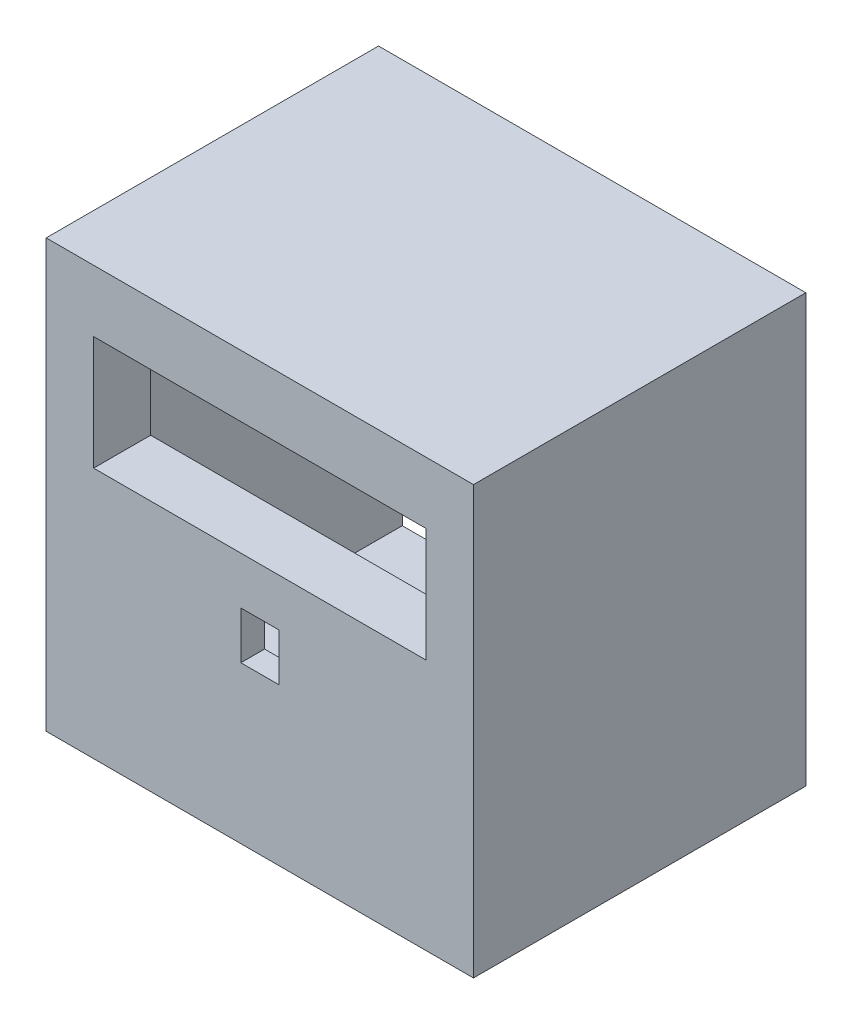
ISO-10303-21;
HEADER;
FILE_DESCRIPTION(('STEP AP214'),'2;1');
FILE_NAME('part.step','',(''),(''),'','','');
FILE_SCHEMA(('AUTOMOTIVE_DESIGN { 1 0 10303 214 1 1 1 1 }'));
ENDSEC;
DATA;
#1=APPLICATION_CONTEXT('core data for automotive mechanical design processes');
#2=APPLICATION_PROTOCOL_DEFINITION('international standard','automotive_design',2000,#1);
#3=PRODUCT_CONTEXT('',#1,'mechanical');
#4=PRODUCT('Part','Part','',(#3));
#5=PRODUCT_RELATED_PRODUCT_CATEGORY('part','',(#4));
#6=PRODUCT_DEFINITION_FORMATION('','',#4);
#7=PRODUCT_DEFINITION_CONTEXT('part definition',#1,'design');
#8=PRODUCT_DEFINITION('design','',#6,#7);
#9=PRODUCT_DEFINITION_SHAPE('','',#8);
#10=(LENGTH_UNIT() NAMED_UNIT(*) SI_UNIT(.MILLI.,.METRE.));
#11=(NAMED_UNIT(*) PLANE_ANGLE_UNIT() SI_UNIT($,.RADIAN.));
#12=(NAMED_UNIT(*) SI_UNIT($,.STERADIAN.) SOLID_ANGLE_UNIT());
#13=UNCERTAINTY_MEASURE_WITH_UNIT(LENGTH_MEASURE(1.E-05),#10,'distance_accuracy_value','');
#14=(GEOMETRIC_REPRESENTATION_CONTEXT(3) GLOBAL_UNCERTAINTY_ASSIGNED_CONTEXT((#13)) GLOBAL_UNIT_ASSIGNED_CONTEXT((#10,
#11,#12)) REPRESENTATION_CONTEXT('',''));
#15=CARTESIAN_POINT('',(0.,0.,0.));
#16=DIRECTION('',(0.,0.,1.));
#17=DIRECTION('',(1.,0.,0.));
#18=AXIS2_PLACEMENT_3D('',#15,#16,#17);
#19=CARTESIAN_POINT('',(40.,-45.,70.));
#20=DIRECTION('',(-1.,0.,0.));
#21=DIRECTION('',(0.,0.,1.));
#22=AXIS2_PLACEMENT_3D('',#19,#20,#21);
#23=PLANE('',#22);
#24=DIRECTION('',(0.,0.,1.));
#25=VECTOR('',#24,1.);
#26=CARTESIAN_POINT('',(40.,38.,58.));
#27=LINE('',#26,#25);
#28=CARTESIAN_POINT('',(40.,38.,58.));
#29=VERTEX_POINT('',#28);
#30=CARTESIAN_POINT('',(40.,38.,65.));
#31=VERTEX_POINT('',#30);
#32=EDGE_CURVE('E250',#29,#31,#27,.T.);
#33=ORIENTED_EDGE('',*,*,#32,.T.);
#34=DIRECTION('',(0.,1.,0.));
#35=VECTOR('',#34,1.);
#36=CARTESIAN_POINT('',(40.,0.,65.));
#37=LINE('',#36,#35);
#38=CARTESIAN_POINT('',(40.,40.,65.));
#39=VERTEX_POINT('',#38);
#40=EDGE_CURVE('E297',#31,#39,#37,.T.);
#41=ORIENTED_EDGE('',*,*,#40,.T.);
#42=DIRECTION('',(0.,0.,-1.));
#43=VECTOR('',#42,1.);
#44=CARTESIAN_POINT('',(40.,40.,70.));
#45=LINE('',#44,#43);
#46=CARTESIAN_POINT('',(40.,40.,0.));
#47=VERTEX_POINT('',#46);
#48=EDGE_CURVE('E287',#39,#47,#45,.T.);
#49=ORIENTED_EDGE('',*,*,#48,.T.);
#50=DIRECTION('',(0.,1.,0.));
#51=VECTOR('',#50,1.);
#52=CARTESIAN_POINT('',(40.,0.,0.));
#53=LINE('',#52,#51);
#54=CARTESIAN_POINT('',(40.,-40.,0.));
#55=VERTEX_POINT('',#54);
#56=EDGE_CURVE('E286',#55,#47,#53,.T.);
#57=ORIENTED_EDGE('',*,*,#56,.F.);
#58=DIRECTION('',(0.,0.,-1.));
#59=VECTOR('',#58,1.);
#60=CARTESIAN_POINT('',(40.,-40.,70.));
#61=LINE('',#60,#59);
#62=CARTESIAN_POINT('',(40.,-40.,65.));
#63=VERTEX_POINT('',#62);
#64=EDGE_CURVE('E298',#63,#55,#61,.T.);
#65=ORIENTED_EDGE('',*,*,#64,.F.);
#66=CARTESIAN_POINT('',(40.,1.99999999999999,65.));
#67=VERTEX_POINT('',#66);
#68=EDGE_CURVE('E292',#63,#67,#37,.T.);
#69=ORIENTED_EDGE('',*,*,#68,.T.);
#70=DIRECTION('',(0.,0.,1.));
#71=VECTOR('',#70,1.);
#72=CARTESIAN_POINT('',(40.,1.99999999999999,58.));
#73=LINE('',#72,#71);
#74=CARTESIAN_POINT('',(40.,1.99999999999999,58.));
#75=VERTEX_POINT('',#74);
#76=EDGE_CURVE('E258',#75,#67,#73,.T.);
#77=ORIENTED_EDGE('',*,*,#76,.F.);
#78=DIRECTION('',(0.,-1.,0.));
#79=VECTOR('',#78,1.);
#80=CARTESIAN_POINT('',(40.,0.,58.));
#81=LINE('',#80,#79);
#82=CARTESIAN_POINT('',(40.,7.99999999999999,58.));
#83=VERTEX_POINT('',#82);
#84=EDGE_CURVE('E224',#83,#75,#81,.T.);
#85=ORIENTED_EDGE('',*,*,#84,.F.);
#86=DIRECTION('',(0.,0.,1.));
#87=VECTOR('',#86,1.);
#88=CARTESIAN_POINT('',(40.,7.99999999999999,58.));
#89=LINE('',#88,#87);
#90=CARTESIAN_POINT('',(40.,7.99999999999999,65.));
#91=VERTEX_POINT('',#90);
#92=EDGE_CURVE('E260',#83,#91,#89,.T.);
#93=ORIENTED_EDGE('',*,*,#92,.T.);
#94=CARTESIAN_POINT('',(40.,32.,65.));
#95=VERTEX_POINT('',#94);
#96=EDGE_CURVE('E296',#91,#95,#37,.T.);
#97=ORIENTED_EDGE('',*,*,#96,.T.);
#98=DIRECTION('',(0.,0.,1.));
#99=VECTOR('',#98,1.);
#100=CARTESIAN_POINT('',(40.,32.,58.));
#101=LINE('',#100,#99);
#102=CARTESIAN_POINT('',(40.,32.,58.));
#103=VERTEX_POINT('',#102);
#104=EDGE_CURVE('E241',#103,#95,#101,.T.);
#105=ORIENTED_EDGE('',*,*,#104,.F.);
#106=EDGE_CURVE('E228',#29,#103,#81,.T.);
#107=ORIENTED_EDGE('',*,*,#106,.F.);
#108=EDGE_LOOP('',(#33,#41,#49,#57,#65,#69,#77,#85,#93,#97,#105,#107));
#109=FACE_BOUND('',#108,.T.);
#110=ADVANCED_FACE('F37',(#109),#23,.T.);
#111=CARTESIAN_POINT('',(-40.,-45.,70.));
#112=DIRECTION('',(1.,0.,0.));
#113=DIRECTION('',(0.,0.,-1.));
#114=AXIS2_PLACEMENT_3D('',#111,#112,#113);
#115=PLANE('',#114);
#116=DIRECTION('',(0.,1.,0.));
#117=VECTOR('',#116,1.);
#118=CARTESIAN_POINT('',(-40.,0.,58.));
#119=LINE('',#118,#117);
#120=CARTESIAN_POINT('',(-40.,1.99999999999999,58.));
#121=VERTEX_POINT('',#120);
#122=CARTESIAN_POINT('',(-40.,38.,58.));
#123=VERTEX_POINT('',#122);
#124=EDGE_CURVE('E230',#121,#123,#119,.T.);
#125=ORIENTED_EDGE('',*,*,#124,.F.);
#126=DIRECTION('',(0.,0.,1.));
#127=VECTOR('',#126,1.);
#128=CARTESIAN_POINT('',(-40.,1.99999999999999,58.));
#129=LINE('',#128,#127);
#130=CARTESIAN_POINT('',(-40.,1.99999999999999,65.));
#131=VERTEX_POINT('',#130);
#132=EDGE_CURVE('E255',#121,#131,#129,.T.);
#133=ORIENTED_EDGE('',*,*,#132,.T.);
#134=DIRECTION('',(0.,-1.,0.));
#135=VECTOR('',#134,1.);
#136=CARTESIAN_POINT('',(-40.,0.,65.));
#137=LINE('',#136,#135);
#138=CARTESIAN_POINT('',(-40.,-40.,65.));
#139=VERTEX_POINT('',#138);
#140=EDGE_CURVE('E305',#131,#139,#137,.T.);
#141=ORIENTED_EDGE('',*,*,#140,.T.);
#142=DIRECTION('',(0.,0.,-1.));
#143=VECTOR('',#142,1.);
#144=CARTESIAN_POINT('',(-40.,-40.,70.));
#145=LINE('',#144,#143);
#146=CARTESIAN_POINT('',(-40.,-40.,0.));
#147=VERTEX_POINT('',#146);
#148=EDGE_CURVE('E300',#139,#147,#145,.T.);
#149=ORIENTED_EDGE('',*,*,#148,.T.);
#150=DIRECTION('',(0.,-1.,0.));
#151=VECTOR('',#150,1.);
#152=CARTESIAN_POINT('',(-40.,0.,0.));
#153=LINE('',#152,#151);
#154=CARTESIAN_POINT('',(-40.,40.,0.));
#155=VERTEX_POINT('',#154);
#156=EDGE_CURVE('E317',#155,#147,#153,.T.);
#157=ORIENTED_EDGE('',*,*,#156,.F.);
#158=DIRECTION('',(0.,0.,-1.));
#159=VECTOR('',#158,1.);
#160=CARTESIAN_POINT('',(-40.,40.,70.));
#161=LINE('',#160,#159);
#162=CARTESIAN_POINT('',(-40.,40.,65.));
#163=VERTEX_POINT('',#162);
#164=EDGE_CURVE('E291',#163,#155,#161,.T.);
#165=ORIENTED_EDGE('',*,*,#164,.F.);
#166=CARTESIAN_POINT('',(-40.,38.,65.));
#167=VERTEX_POINT('',#166);
#168=EDGE_CURVE('E307',#163,#167,#137,.T.);
#169=ORIENTED_EDGE('',*,*,#168,.T.);
#170=DIRECTION('',(0.,0.,1.));
#171=VECTOR('',#170,1.);
#172=CARTESIAN_POINT('',(-40.,38.,58.));
#173=LINE('',#172,#171);
#174=EDGE_CURVE('E253',#123,#167,#173,.T.);
#175=ORIENTED_EDGE('',*,*,#174,.F.);
#176=EDGE_LOOP('',(#125,#133,#141,#149,#157,#165,#169,#175));
#177=FACE_BOUND('',#176,.T.);
#178=ADVANCED_FACE('F373',(#177),#115,.T.);
#179=CARTESIAN_POINT('',(0.,0.,65.));
#180=DIRECTION('',(0.,0.,-1.));
#181=DIRECTION('',(-1.,0.,0.));
#182=AXIS2_PLACEMENT_3D('',#179,#180,#181);
#183=PLANE('',#182);
#184=ORIENTED_EDGE('',*,*,#96,.F.);
#185=DIRECTION('',(1.,0.,0.));
#186=VECTOR('',#185,1.);
#187=CARTESIAN_POINT('',(0.,7.99999999999999,65.));
#188=LINE('',#187,#186);
#189=CARTESIAN_POINT('',(35.,7.99999999999999,65.));
#190=VERTEX_POINT('',#189);
#191=EDGE_CURVE('E221',#190,#91,#188,.T.);
#192=ORIENTED_EDGE('',*,*,#191,.F.);
#193=DIRECTION('',(0.,1.,0.));
#194=VECTOR('',#193,1.);
#195=CARTESIAN_POINT('',(35.,0.,65.));
#196=LINE('',#195,#194);
#197=CARTESIAN_POINT('',(35.,32.,65.));
#198=VERTEX_POINT('',#197);
#199=EDGE_CURVE('E277',#190,#198,#196,.T.);
#200=ORIENTED_EDGE('',*,*,#199,.T.);
#201=DIRECTION('',(-1.,0.,0.));
#202=VECTOR('',#201,1.);
#203=CARTESIAN_POINT('',(0.,32.,65.));
#204=LINE('',#203,#202);
#205=EDGE_CURVE('E225',#95,#198,#204,.T.);
#206=ORIENTED_EDGE('',*,*,#205,.F.);
#207=EDGE_LOOP('',(#184,#192,#200,#206));
#208=FACE_BOUND('',#207,.T.);
#209=ADVANCED_FACE('F379',(#208),#183,.T.);
#210=DIRECTION('',(0.,-1.,0.));
#211=VECTOR('',#210,1.);
#212=CARTESIAN_POINT('',(3.99999999999999,0.,65.));
#213=LINE('',#212,#211);
#214=CARTESIAN_POINT('',(3.99999999999999,-2.00000000000001,65.));
#215=VERTEX_POINT('',#214);
#216=CARTESIAN_POINT('',(3.99999999999999,-12.,65.));
#217=VERTEX_POINT('',#216);
#218=EDGE_CURVE('E219',#215,#217,#213,.T.);
#219=ORIENTED_EDGE('',*,*,#218,.F.);
#220=DIRECTION('',(1.,0.,0.));
#221=VECTOR('',#220,1.);
#222=CARTESIAN_POINT('',(0.,-2.00000000000001,65.));
#223=LINE('',#222,#221);
#224=CARTESIAN_POINT('',(-4.00000000000001,-2.00000000000001,65.));
#225=VERTEX_POINT('',#224);
#226=EDGE_CURVE('E212',#225,#215,#223,.T.);
#227=ORIENTED_EDGE('',*,*,#226,.F.);
#228=DIRECTION('',(0.,1.,0.));
#229=VECTOR('',#228,1.);
#230=CARTESIAN_POINT('',(-4.00000000000001,0.,65.));
#231=LINE('',#230,#229);
#232=CARTESIAN_POINT('',(-4.00000000000001,-12.,65.));
#233=VERTEX_POINT('',#232);
#234=EDGE_CURVE('E192',#233,#225,#231,.T.);
#235=ORIENTED_EDGE('',*,*,#234,.F.);
#236=DIRECTION('',(-1.,0.,0.));
#237=VECTOR('',#236,1.);
#238=CARTESIAN_POINT('',(0.,-12.,65.));
#239=LINE('',#238,#237);
#240=EDGE_CURVE('E217',#217,#233,#239,.T.);
#241=ORIENTED_EDGE('',*,*,#240,.F.);
#242=EDGE_LOOP('',(#219,#227,#235,#241));
#243=FACE_BOUND('',#242,.T.);
#244=ORIENTED_EDGE('',*,*,#140,.F.);
#245=DIRECTION('',(-1.,0.,0.));
#246=VECTOR('',#245,1.);
#247=CARTESIAN_POINT('',(0.,1.99999999999999,65.));
#248=LINE('',#247,#246);
#249=EDGE_CURVE('E243',#67,#131,#248,.T.);
#250=ORIENTED_EDGE('',*,*,#249,.F.);
#251=ORIENTED_EDGE('',*,*,#68,.F.);
#252=DIRECTION('',(1.,0.,0.));
#253=VECTOR('',#252,1.);
#254=CARTESIAN_POINT('',(0.,-40.,65.));
#255=LINE('',#254,#253);
#256=EDGE_CURVE('E301',#139,#63,#255,.T.);
#257=ORIENTED_EDGE('',*,*,#256,.F.);
#258=EDGE_LOOP('',(#244,#250,#251,#257));
#259=FACE_BOUND('',#258,.T.);
#260=ADVANCED_FACE('F398',(#243,#259),#183,.T.);
#261=CARTESIAN_POINT('',(0.,0.,0.));
#262=DIRECTION('',(0.,0.,-1.));
#263=DIRECTION('',(-1.,0.,0.));
#264=AXIS2_PLACEMENT_3D('',#261,#262,#263);
#265=PLANE('',#264);
#266=DIRECTION('',(0.,1.,0.));
#267=VECTOR('',#266,1.);
#268=CARTESIAN_POINT('',(45.,-45.,0.));
#269=LINE('',#268,#267);
#270=CARTESIAN_POINT('',(45.,-45.,0.));
#271=VERTEX_POINT('',#270);
#272=CARTESIAN_POINT('',(45.,45.,0.));
#273=VERTEX_POINT('',#272);
#274=EDGE_CURVE('E290',#271,#273,#269,.T.);
#275=ORIENTED_EDGE('',*,*,#274,.F.);
#276=DIRECTION('',(1.,0.,0.));
#277=VECTOR('',#276,1.);
#278=CARTESIAN_POINT('',(-45.,-45.,0.));
#279=LINE('',#278,#277);
#280=CARTESIAN_POINT('',(-45.,-45.,0.));
#281=VERTEX_POINT('',#280);
#282=EDGE_CURVE('E326',#281,#271,#279,.T.);
#283=ORIENTED_EDGE('',*,*,#282,.F.);
#284=DIRECTION('',(0.,-1.,0.));
#285=VECTOR('',#284,1.);
#286=CARTESIAN_POINT('',(-45.,-45.,0.));
#287=LINE('',#286,#285);
#288=CARTESIAN_POINT('',(-45.,45.,0.));
#289=VERTEX_POINT('',#288);
#290=EDGE_CURVE('E337',#289,#281,#287,.T.);
#291=ORIENTED_EDGE('',*,*,#290,.F.);
#292=DIRECTION('',(-1.,0.,0.));
#293=VECTOR('',#292,1.);
#294=CARTESIAN_POINT('',(-45.,45.,0.));
#295=LINE('',#294,#293);
#296=EDGE_CURVE('E335',#273,#289,#295,.T.);
#297=ORIENTED_EDGE('',*,*,#296,.F.);
#298=EDGE_LOOP('',(#275,#283,#291,#297));
#299=FACE_BOUND('',#298,.T.);
#300=DIRECTION('',(1.,0.,0.));
#301=VECTOR('',#300,1.);
#302=CARTESIAN_POINT('',(0.,-40.,0.));
#303=LINE('',#302,#301);
#304=EDGE_CURVE('E314',#147,#55,#303,.T.);
#305=ORIENTED_EDGE('',*,*,#304,.T.);
#306=ORIENTED_EDGE('',*,*,#56,.T.);
#307=DIRECTION('',(-1.,0.,0.));
#308=VECTOR('',#307,1.);
#309=CARTESIAN_POINT('',(0.,40.,0.));
#310=LINE('',#309,#308);
#311=EDGE_CURVE('E313',#47,#155,#310,.T.);
#312=ORIENTED_EDGE('',*,*,#311,.T.);
#313=ORIENTED_EDGE('',*,*,#156,.T.);
#314=EDGE_LOOP('',(#305,#306,#312,#313));
#315=FACE_BOUND('',#314,.T.);
#316=ADVANCED_FACE('F355',(#299,#315),#265,.T.);
#317=CARTESIAN_POINT('',(45.,-45.,70.));
#318=DIRECTION('',(-1.,0.,0.));
#319=DIRECTION('',(0.,0.,1.));
#320=AXIS2_PLACEMENT_3D('',#317,#318,#319);
#321=PLANE('',#320);
#322=ORIENTED_EDGE('',*,*,#274,.T.);
#323=DIRECTION('',(0.,0.,-1.));
#324=VECTOR('',#323,1.);
#325=CARTESIAN_POINT('',(45.,45.,70.));
#326=LINE('',#325,#324);
#327=CARTESIAN_POINT('',(45.,45.,70.));
#328=VERTEX_POINT('',#327);
#329=EDGE_CURVE('E11',#328,#273,#326,.T.);
#330=ORIENTED_EDGE('',*,*,#329,.F.);
#331=DIRECTION('',(0.,1.,0.));
#332=VECTOR('',#331,1.);
#333=CARTESIAN_POINT('',(45.,-45.,70.));
#334=LINE('',#333,#332);
#335=CARTESIAN_POINT('',(45.,-45.,70.));
#336=VERTEX_POINT('',#335);
#337=EDGE_CURVE('E322',#336,#328,#334,.T.);
#338=ORIENTED_EDGE('',*,*,#337,.F.);
#339=DIRECTION('',(0.,0.,-1.));
#340=VECTOR('',#339,1.);
#341=CARTESIAN_POINT('',(45.,-45.,70.));
#342=LINE('',#341,#340);
#343=EDGE_CURVE('E332',#336,#271,#342,.T.);
#344=ORIENTED_EDGE('',*,*,#343,.T.);
#345=EDGE_LOOP('',(#322,#330,#338,#344));
#346=FACE_BOUND('',#345,.T.);
#347=ADVANCED_FACE('F39',(#346),#321,.F.);
#348=CARTESIAN_POINT('',(-45.,45.,70.));
#349=DIRECTION('',(0.,-1.,0.));
#350=DIRECTION('',(0.,0.,-1.));
#351=AXIS2_PLACEMENT_3D('',#348,#349,#350);
#352=PLANE('',#351);
#353=ORIENTED_EDGE('',*,*,#296,.T.);
#354=DIRECTION('',(0.,0.,-1.));
#355=VECTOR('',#354,1.);
#356=CARTESIAN_POINT('',(-45.,45.,70.));
#357=LINE('',#356,#355);
#358=CARTESIAN_POINT('',(-45.,45.,70.));
#359=VERTEX_POINT('',#358);
#360=EDGE_CURVE('E45',#359,#289,#357,.T.);
#361=ORIENTED_EDGE('',*,*,#360,.F.);
#362=DIRECTION('',(-1.,0.,0.));
#363=VECTOR('',#362,1.);
#364=CARTESIAN_POINT('',(-45.,45.,70.));
#365=LINE('',#364,#363);
#366=EDGE_CURVE('E325',#328,#359,#365,.T.);
#367=ORIENTED_EDGE('',*,*,#366,.F.);
#368=ORIENTED_EDGE('',*,*,#329,.T.);
#369=EDGE_LOOP('',(#353,#361,#367,#368));
#370=FACE_BOUND('',#369,.T.);
#371=ADVANCED_FACE('F365',(#370),#352,.F.);
#372=CARTESIAN_POINT('',(-45.,-45.,70.));
#373=DIRECTION('',(1.,0.,0.));
#374=DIRECTION('',(0.,0.,-1.));
#375=AXIS2_PLACEMENT_3D('',#372,#373,#374);
#376=PLANE('',#375);
#377=ORIENTED_EDGE('',*,*,#290,.T.);
#378=DIRECTION('',(0.,0.,-1.));
#379=VECTOR('',#378,1.);
#380=CARTESIAN_POINT('',(-45.,-45.,70.));
#381=LINE('',#380,#379);
#382=CARTESIAN_POINT('',(-45.,-45.,70.));
#383=VERTEX_POINT('',#382);
#384=EDGE_CURVE('E342',#383,#281,#381,.T.);
#385=ORIENTED_EDGE('',*,*,#384,.F.);
#386=DIRECTION('',(0.,-1.,0.));
#387=VECTOR('',#386,1.);
#388=CARTESIAN_POINT('',(-45.,-45.,70.));
#389=LINE('',#388,#387);
#390=EDGE_CURVE('E328',#359,#383,#389,.T.);
#391=ORIENTED_EDGE('',*,*,#390,.F.);
#392=ORIENTED_EDGE('',*,*,#360,.T.);
#393=EDGE_LOOP('',(#377,#385,#391,#392));
#394=FACE_BOUND('',#393,.T.);
#395=ADVANCED_FACE('F349',(#394),#376,.F.);
#396=CARTESIAN_POINT('',(-45.,-45.,70.));
#397=DIRECTION('',(0.,1.,0.));
#398=DIRECTION('',(0.,0.,1.));
#399=AXIS2_PLACEMENT_3D('',#396,#397,#398);
#400=PLANE('',#399);
#401=ORIENTED_EDGE('',*,*,#282,.T.);
#402=ORIENTED_EDGE('',*,*,#343,.F.);
#403=DIRECTION('',(1.,0.,0.));
#404=VECTOR('',#403,1.);
#405=CARTESIAN_POINT('',(-45.,-45.,70.));
#406=LINE('',#405,#404);
#407=EDGE_CURVE('E330',#383,#336,#406,.T.);
#408=ORIENTED_EDGE('',*,*,#407,.F.);
#409=ORIENTED_EDGE('',*,*,#384,.T.);
#410=EDGE_LOOP('',(#401,#402,#408,#409));
#411=FACE_BOUND('',#410,.T.);
#412=ADVANCED_FACE('F359',(#411),#400,.F.);
#413=CARTESIAN_POINT('',(0.,0.,70.));
#414=DIRECTION('',(0.,0.,-1.));
#415=DIRECTION('',(-1.,0.,0.));
#416=AXIS2_PLACEMENT_3D('',#413,#414,#415);
#417=PLANE('',#416);
#418=DIRECTION('',(-1.,0.,0.));
#419=VECTOR('',#418,1.);
#420=CARTESIAN_POINT('',(-4.00000000000001,-2.00000000000001,70.));
#421=LINE('',#420,#419);
#422=CARTESIAN_POINT('',(3.99999999999999,-2.00000000000001,70.));
#423=VERTEX_POINT('',#422);
#424=CARTESIAN_POINT('',(-4.00000000000001,-2.00000000000001,70.));
#425=VERTEX_POINT('',#424);
#426=EDGE_CURVE('E198',#423,#425,#421,.T.);
#427=ORIENTED_EDGE('',*,*,#426,.F.);
#428=DIRECTION('',(0.,1.,0.));
#429=VECTOR('',#428,1.);
#430=CARTESIAN_POINT('',(3.99999999999999,-12.,70.));
#431=LINE('',#430,#429);
#432=CARTESIAN_POINT('',(3.99999999999999,-12.,70.));
#433=VERTEX_POINT('',#432);
#434=EDGE_CURVE('E60',#433,#423,#431,.T.);
#435=ORIENTED_EDGE('',*,*,#434,.F.);
#436=DIRECTION('',(1.,0.,0.));
#437=VECTOR('',#436,1.);
#438=CARTESIAN_POINT('',(-4.00000000000001,-12.,70.));
#439=LINE('',#438,#437);
#440=CARTESIAN_POINT('',(-4.00000000000001,-12.,70.));
#441=VERTEX_POINT('',#440);
#442=EDGE_CURVE('E205',#441,#433,#439,.T.);
#443=ORIENTED_EDGE('',*,*,#442,.F.);
#444=DIRECTION('',(0.,-1.,0.));
#445=VECTOR('',#444,1.);
#446=CARTESIAN_POINT('',(-4.00000000000001,-12.,70.));
#447=LINE('',#446,#445);
#448=EDGE_CURVE('E189',#425,#441,#447,.T.);
#449=ORIENTED_EDGE('',*,*,#448,.F.);
#450=EDGE_LOOP('',(#427,#435,#443,#449));
#451=FACE_BOUND('',#450,.T.);
#452=DIRECTION('',(0.,1.,0.));
#453=VECTOR('',#452,1.);
#454=CARTESIAN_POINT('',(35.,0.,70.));
#455=LINE('',#454,#453);
#456=CARTESIAN_POINT('',(35.,7.99999999999999,70.));
#457=VERTEX_POINT('',#456);
#458=CARTESIAN_POINT('',(35.,32.,70.));
#459=VERTEX_POINT('',#458);
#460=EDGE_CURVE('E265',#457,#459,#455,.T.);
#461=ORIENTED_EDGE('',*,*,#460,.F.);
#462=DIRECTION('',(1.,0.,0.));
#463=VECTOR('',#462,1.);
#464=CARTESIAN_POINT('',(0.,7.99999999999999,70.));
#465=LINE('',#464,#463);
#466=CARTESIAN_POINT('',(-35.,7.99999999999999,70.));
#467=VERTEX_POINT('',#466);
#468=EDGE_CURVE('E263',#467,#457,#465,.T.);
#469=ORIENTED_EDGE('',*,*,#468,.F.);
#470=DIRECTION('',(0.,1.,0.));
#471=VECTOR('',#470,1.);
#472=CARTESIAN_POINT('',(-35.,0.,70.));
#473=LINE('',#472,#471);
#474=CARTESIAN_POINT('',(-35.,32.,70.));
#475=VERTEX_POINT('',#474);
#476=EDGE_CURVE('E271',#467,#475,#473,.T.);
#477=ORIENTED_EDGE('',*,*,#476,.T.);
#478=DIRECTION('',(1.,0.,0.));
#479=VECTOR('',#478,1.);
#480=CARTESIAN_POINT('',(0.,32.,70.));
#481=LINE('',#480,#479);
#482=EDGE_CURVE('E268',#475,#459,#481,.T.);
#483=ORIENTED_EDGE('',*,*,#482,.T.);
#484=EDGE_LOOP('',(#461,#469,#477,#483));
#485=FACE_BOUND('',#484,.T.);
#486=ORIENTED_EDGE('',*,*,#337,.T.);
#487=ORIENTED_EDGE('',*,*,#366,.T.);
#488=ORIENTED_EDGE('',*,*,#390,.T.);
#489=ORIENTED_EDGE('',*,*,#407,.T.);
#490=EDGE_LOOP('',(#486,#487,#488,#489));
#491=FACE_BOUND('',#490,.T.);
#492=ADVANCED_FACE('F202',(#451,#485,#491),#417,.F.);
#493=CARTESIAN_POINT('',(-45.,40.,70.));
#494=DIRECTION('',(0.,-1.,0.));
#495=DIRECTION('',(0.,0.,-1.));
#496=AXIS2_PLACEMENT_3D('',#493,#494,#495);
#497=PLANE('',#496);
#498=ORIENTED_EDGE('',*,*,#311,.F.);
#499=ORIENTED_EDGE('',*,*,#48,.F.);
#500=DIRECTION('',(-1.,0.,0.));
#501=VECTOR('',#500,1.);
#502=CARTESIAN_POINT('',(0.,40.,65.));
#503=LINE('',#502,#501);
#504=EDGE_CURVE('E295',#39,#163,#503,.T.);
#505=ORIENTED_EDGE('',*,*,#504,.T.);
#506=ORIENTED_EDGE('',*,*,#164,.T.);
#507=EDGE_LOOP('',(#498,#499,#505,#506));
#508=FACE_BOUND('',#507,.T.);
#509=ADVANCED_FACE('F386',(#508),#497,.T.);
#510=CARTESIAN_POINT('',(-45.,-40.,70.));
#511=DIRECTION('',(0.,1.,0.));
#512=DIRECTION('',(0.,0.,1.));
#513=AXIS2_PLACEMENT_3D('',#510,#511,#512);
#514=PLANE('',#513);
#515=ORIENTED_EDGE('',*,*,#304,.F.);
#516=ORIENTED_EDGE('',*,*,#148,.F.);
#517=ORIENTED_EDGE('',*,*,#256,.T.);
#518=ORIENTED_EDGE('',*,*,#64,.T.);
#519=EDGE_LOOP('',(#515,#516,#517,#518));
#520=FACE_BOUND('',#519,.T.);
#521=ADVANCED_FACE('F388',(#520),#514,.T.);
#522=DIRECTION('',(-1.,0.,0.));
#523=VECTOR('',#522,1.);
#524=CARTESIAN_POINT('',(0.,38.,65.));
#525=LINE('',#524,#523);
#526=EDGE_CURVE('E245',#31,#167,#525,.T.);
#527=ORIENTED_EDGE('',*,*,#526,.T.);
#528=ORIENTED_EDGE('',*,*,#168,.F.);
#529=ORIENTED_EDGE('',*,*,#504,.F.);
#530=ORIENTED_EDGE('',*,*,#40,.F.);
#531=EDGE_LOOP('',(#527,#528,#529,#530));
#532=FACE_BOUND('',#531,.T.);
#533=ADVANCED_FACE('F393',(#532),#183,.T.);
#534=CARTESIAN_POINT('',(0.,7.99999999999999,-0.001000000000001));
#535=DIRECTION('',(0.,-1.,0.));
#536=DIRECTION('',(0.,0.,-1.));
#537=AXIS2_PLACEMENT_3D('',#534,#535,#536);
#538=PLANE('',#537);
#539=DIRECTION('',(0.,0.,1.));
#540=VECTOR('',#539,1.);
#541=CARTESIAN_POINT('',(-35.,7.99999999999999,-0.001000000000001));
#542=LINE('',#541,#540);
#543=CARTESIAN_POINT('',(-35.,7.99999999999999,58.));
#544=VERTEX_POINT('',#543);
#545=EDGE_CURVE('E275',#544,#467,#542,.T.);
#546=ORIENTED_EDGE('',*,*,#545,.T.);
#547=ORIENTED_EDGE('',*,*,#468,.T.);
#548=DIRECTION('',(0.,0.,1.));
#549=VECTOR('',#548,1.);
#550=CARTESIAN_POINT('',(35.,7.99999999999999,-0.001000000000001));
#551=LINE('',#550,#549);
#552=EDGE_CURVE('E274',#190,#457,#551,.T.);
#553=ORIENTED_EDGE('',*,*,#552,.F.);
#554=ORIENTED_EDGE('',*,*,#191,.T.);
#555=ORIENTED_EDGE('',*,*,#92,.F.);
#556=DIRECTION('',(1.,0.,0.));
#557=VECTOR('',#556,1.);
#558=CARTESIAN_POINT('',(0.,7.99999999999999,58.));
#559=LINE('',#558,#557);
#560=EDGE_CURVE('E222',#544,#83,#559,.T.);
#561=ORIENTED_EDGE('',*,*,#560,.F.);
#562=EDGE_LOOP('',(#546,#547,#553,#554,#555,#561));
#563=FACE_BOUND('',#562,.T.);
#564=ADVANCED_FACE('F384',(#563),#538,.F.);
#565=CARTESIAN_POINT('',(-35.,0.,-0.001000000000001));
#566=DIRECTION('',(1.,0.,0.));
#567=DIRECTION('',(0.,0.,-1.));
#568=AXIS2_PLACEMENT_3D('',#565,#566,#567);
#569=PLANE('',#568);
#570=ORIENTED_EDGE('',*,*,#545,.F.);
#571=DIRECTION('',(0.,-1.,0.));
#572=VECTOR('',#571,1.);
#573=CARTESIAN_POINT('',(-35.,0.,58.));
#574=LINE('',#573,#572);
#575=CARTESIAN_POINT('',(-35.,32.,58.));
#576=VERTEX_POINT('',#575);
#577=EDGE_CURVE('E238',#576,#544,#574,.T.);
#578=ORIENTED_EDGE('',*,*,#577,.F.);
#579=DIRECTION('',(0.,0.,1.));
#580=VECTOR('',#579,1.);
#581=CARTESIAN_POINT('',(-35.,32.,-0.001000000000001));
#582=LINE('',#581,#580);
#583=EDGE_CURVE('E278',#576,#475,#582,.T.);
#584=ORIENTED_EDGE('',*,*,#583,.T.);
#585=ORIENTED_EDGE('',*,*,#476,.F.);
#586=EDGE_LOOP('',(#570,#578,#584,#585));
#587=FACE_BOUND('',#586,.T.);
#588=ADVANCED_FACE('F434',(#587),#569,.T.);
#589=CARTESIAN_POINT('',(0.,32.,-0.001000000000001));
#590=DIRECTION('',(0.,-1.,0.));
#591=DIRECTION('',(0.,0.,-1.));
#592=AXIS2_PLACEMENT_3D('',#589,#590,#591);
#593=PLANE('',#592);
#594=ORIENTED_EDGE('',*,*,#583,.F.);
#595=DIRECTION('',(-1.,0.,0.));
#596=VECTOR('',#595,1.);
#597=CARTESIAN_POINT('',(0.,32.,58.));
#598=LINE('',#597,#596);
#599=EDGE_CURVE('E235',#103,#576,#598,.T.);
#600=ORIENTED_EDGE('',*,*,#599,.F.);
#601=ORIENTED_EDGE('',*,*,#104,.T.);
#602=ORIENTED_EDGE('',*,*,#205,.T.);
#603=DIRECTION('',(0.,0.,1.));
#604=VECTOR('',#603,1.);
#605=CARTESIAN_POINT('',(35.,32.,-0.001000000000001));
#606=LINE('',#605,#604);
#607=EDGE_CURVE('E280',#198,#459,#606,.T.);
#608=ORIENTED_EDGE('',*,*,#607,.T.);
#609=ORIENTED_EDGE('',*,*,#482,.F.);
#610=EDGE_LOOP('',(#594,#600,#601,#602,#608,#609));
#611=FACE_BOUND('',#610,.T.);
#612=ADVANCED_FACE('F441',(#611),#593,.T.);
#613=CARTESIAN_POINT('',(35.,0.,-0.001000000000001));
#614=DIRECTION('',(1.,0.,0.));
#615=DIRECTION('',(0.,0.,-1.));
#616=AXIS2_PLACEMENT_3D('',#613,#614,#615);
#617=PLANE('',#616);
#618=ORIENTED_EDGE('',*,*,#552,.T.);
#619=ORIENTED_EDGE('',*,*,#460,.T.);
#620=ORIENTED_EDGE('',*,*,#607,.F.);
#621=ORIENTED_EDGE('',*,*,#199,.F.);
#622=EDGE_LOOP('',(#618,#619,#620,#621));
#623=FACE_BOUND('',#622,.T.);
#624=ADVANCED_FACE('F449',(#623),#617,.F.);
#625=CARTESIAN_POINT('',(0.,1.99999999999999,58.));
#626=DIRECTION('',(0.,1.,0.));
#627=DIRECTION('',(0.,0.,1.));
#628=AXIS2_PLACEMENT_3D('',#625,#626,#627);
#629=PLANE('',#628);
#630=ORIENTED_EDGE('',*,*,#249,.T.);
#631=ORIENTED_EDGE('',*,*,#132,.F.);
#632=DIRECTION('',(-1.,0.,0.));
#633=VECTOR('',#632,1.);
#634=CARTESIAN_POINT('',(0.,1.99999999999999,58.));
#635=LINE('',#634,#633);
#636=EDGE_CURVE('E227',#75,#121,#635,.T.);
#637=ORIENTED_EDGE('',*,*,#636,.F.);
#638=ORIENTED_EDGE('',*,*,#76,.T.);
#639=EDGE_LOOP('',(#630,#631,#637,#638));
#640=FACE_BOUND('',#639,.T.);
#641=ADVANCED_FACE('F457',(#640),#629,.F.);
#642=CARTESIAN_POINT('',(0.,38.,58.));
#643=DIRECTION('',(0.,1.,0.));
#644=DIRECTION('',(0.,0.,1.));
#645=AXIS2_PLACEMENT_3D('',#642,#643,#644);
#646=PLANE('',#645);
#647=ORIENTED_EDGE('',*,*,#526,.F.);
#648=ORIENTED_EDGE('',*,*,#32,.F.);
#649=DIRECTION('',(-1.,0.,0.));
#650=VECTOR('',#649,1.);
#651=CARTESIAN_POINT('',(0.,38.,58.));
#652=LINE('',#651,#650);
#653=EDGE_CURVE('E232',#29,#123,#652,.T.);
#654=ORIENTED_EDGE('',*,*,#653,.T.);
#655=ORIENTED_EDGE('',*,*,#174,.T.);
#656=EDGE_LOOP('',(#647,#648,#654,#655));
#657=FACE_BOUND('',#656,.T.);
#658=ADVANCED_FACE('F464',(#657),#646,.T.);
#659=CARTESIAN_POINT('',(0.,0.,58.));
#660=DIRECTION('',(0.,0.,-1.));
#661=DIRECTION('',(-1.,0.,0.));
#662=AXIS2_PLACEMENT_3D('',#659,#660,#661);
#663=PLANE('',#662);
#664=ORIENTED_EDGE('',*,*,#560,.T.);
#665=ORIENTED_EDGE('',*,*,#84,.T.);
#666=ORIENTED_EDGE('',*,*,#636,.T.);
#667=ORIENTED_EDGE('',*,*,#124,.T.);
#668=ORIENTED_EDGE('',*,*,#653,.F.);
#669=ORIENTED_EDGE('',*,*,#106,.T.);
#670=ORIENTED_EDGE('',*,*,#599,.T.);
#671=ORIENTED_EDGE('',*,*,#577,.T.);
#672=EDGE_LOOP('',(#664,#665,#666,#667,#668,#669,#670,#671));
#673=FACE_BOUND('',#672,.T.);
#674=ADVANCED_FACE('F472',(#673),#663,.T.);
#675=CARTESIAN_POINT('',(3.99999999999999,-12.,60.));
#676=DIRECTION('',(1.,0.,0.));
#677=DIRECTION('',(0.,0.,-1.));
#678=AXIS2_PLACEMENT_3D('',#675,#676,#677);
#679=PLANE('',#678);
#680=ORIENTED_EDGE('',*,*,#218,.T.);
#681=DIRECTION('',(0.,0.,1.));
#682=VECTOR('',#681,1.);
#683=CARTESIAN_POINT('',(3.99999999999999,-12.,60.));
#684=LINE('',#683,#682);
#685=EDGE_CURVE('E210',#217,#433,#684,.T.);
#686=ORIENTED_EDGE('',*,*,#685,.T.);
#687=ORIENTED_EDGE('',*,*,#434,.T.);
#688=DIRECTION('',(0.,0.,1.));
#689=VECTOR('',#688,1.);
#690=CARTESIAN_POINT('',(3.99999999999999,-2.00000000000001,60.));
#691=LINE('',#690,#689);
#692=EDGE_CURVE('E195',#215,#423,#691,.T.);
#693=ORIENTED_EDGE('',*,*,#692,.F.);
#694=EDGE_LOOP('',(#680,#686,#687,#693));
#695=FACE_BOUND('',#694,.T.);
#696=ADVANCED_FACE('F480',(#695),#679,.F.);
#697=CARTESIAN_POINT('',(-4.00000000000001,-12.,60.));
#698=DIRECTION('',(0.,-1.,0.));
#699=DIRECTION('',(0.,0.,-1.));
#700=AXIS2_PLACEMENT_3D('',#697,#698,#699);
#701=PLANE('',#700);
#702=ORIENTED_EDGE('',*,*,#240,.T.);
#703=DIRECTION('',(0.,0.,1.));
#704=VECTOR('',#703,1.);
#705=CARTESIAN_POINT('',(-4.00000000000001,-12.,60.));
#706=LINE('',#705,#704);
#707=EDGE_CURVE('E194',#233,#441,#706,.T.);
#708=ORIENTED_EDGE('',*,*,#707,.T.);
#709=ORIENTED_EDGE('',*,*,#442,.T.);
#710=ORIENTED_EDGE('',*,*,#685,.F.);
#711=EDGE_LOOP('',(#702,#708,#709,#710));
#712=FACE_BOUND('',#711,.T.);
#713=ADVANCED_FACE('F487',(#712),#701,.F.);
#714=CARTESIAN_POINT('',(-4.00000000000001,-12.,60.));
#715=DIRECTION('',(-1.,0.,0.));
#716=DIRECTION('',(0.,0.,1.));
#717=AXIS2_PLACEMENT_3D('',#714,#715,#716);
#718=PLANE('',#717);
#719=ORIENTED_EDGE('',*,*,#234,.T.);
#720=DIRECTION('',(0.,0.,1.));
#721=VECTOR('',#720,1.);
#722=CARTESIAN_POINT('',(-4.00000000000001,-2.00000000000001,60.));
#723=LINE('',#722,#721);
#724=EDGE_CURVE('E52',#225,#425,#723,.T.);
#725=ORIENTED_EDGE('',*,*,#724,.T.);
#726=ORIENTED_EDGE('',*,*,#448,.T.);
#727=ORIENTED_EDGE('',*,*,#707,.F.);
#728=EDGE_LOOP('',(#719,#725,#726,#727));
#729=FACE_BOUND('',#728,.T.);
#730=ADVANCED_FACE('F186',(#729),#718,.F.);
#731=CARTESIAN_POINT('',(-4.00000000000001,-2.00000000000001,60.));
#732=DIRECTION('',(0.,1.,0.));
#733=DIRECTION('',(0.,0.,1.));
#734=AXIS2_PLACEMENT_3D('',#731,#732,#733);
#735=PLANE('',#734);
#736=ORIENTED_EDGE('',*,*,#226,.T.);
#737=ORIENTED_EDGE('',*,*,#692,.T.);
#738=ORIENTED_EDGE('',*,*,#426,.T.);
#739=ORIENTED_EDGE('',*,*,#724,.F.);
#740=EDGE_LOOP('',(#736,#737,#738,#739));
#741=FACE_BOUND('',#740,.T.);
#742=ADVANCED_FACE('F199',(#741),#735,.F.);
#743=CLOSED_SHELL('',(#110,#178,#209,#260,#316,#347,#371,#395,#412,#492,#509,#521,#533,#564,
#588,#612,#624,#641,#658,#674,#696,#713,#730,#742));
#744=MANIFOLD_SOLID_BREP('B2',#743);
#745=ADVANCED_BREP_SHAPE_REPRESENTATION('',(#18,#744),#14);
#746=SHAPE_DEFINITION_REPRESENTATION(#9,#745);
ENDSEC;
END-ISO-10303-21;
